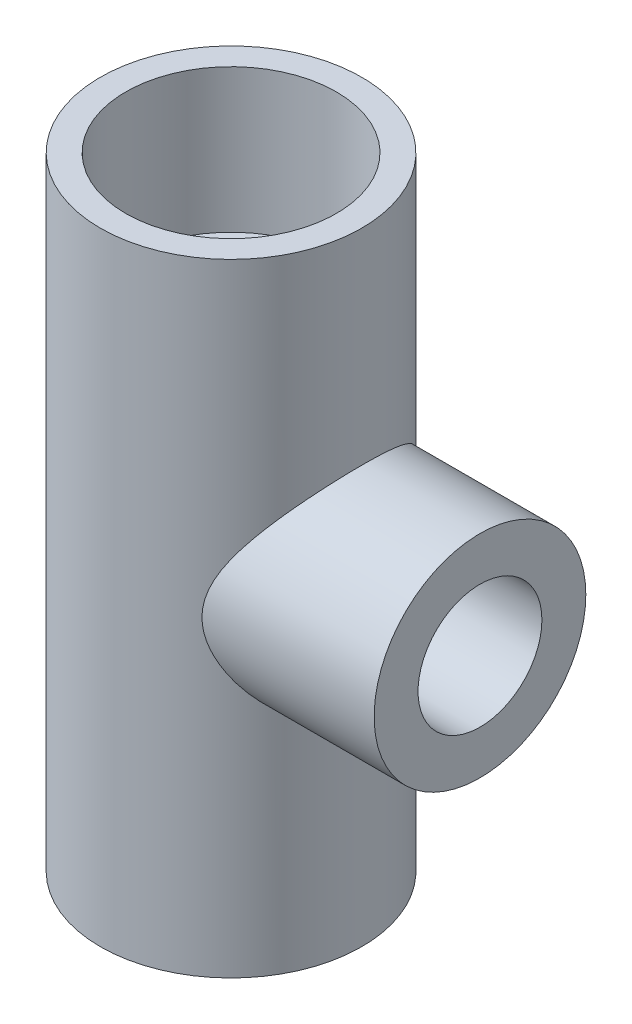
ISO-10303-21;
HEADER;
FILE_DESCRIPTION(('STEP AP214'),'2;1');
FILE_NAME('part.step','',(''),(''),'','','');
FILE_SCHEMA(('AUTOMOTIVE_DESIGN { 1 0 10303 214 1 1 1 1 }'));
ENDSEC;
DATA;
#1=APPLICATION_CONTEXT('core data for automotive mechanical design processes');
#2=APPLICATION_PROTOCOL_DEFINITION('international standard','automotive_design',2000,#1);
#3=PRODUCT_CONTEXT('',#1,'mechanical');
#4=PRODUCT('Part','Part','',(#3));
#5=PRODUCT_RELATED_PRODUCT_CATEGORY('part','',(#4));
#6=PRODUCT_DEFINITION_FORMATION('','',#4);
#7=PRODUCT_DEFINITION_CONTEXT('part definition',#1,'design');
#8=PRODUCT_DEFINITION('design','',#6,#7);
#9=PRODUCT_DEFINITION_SHAPE('','',#8);
#10=(LENGTH_UNIT() NAMED_UNIT(*) SI_UNIT(.MILLI.,.METRE.));
#11=(NAMED_UNIT(*) PLANE_ANGLE_UNIT() SI_UNIT($,.RADIAN.));
#12=(NAMED_UNIT(*) SI_UNIT($,.STERADIAN.) SOLID_ANGLE_UNIT());
#13=UNCERTAINTY_MEASURE_WITH_UNIT(LENGTH_MEASURE(1.E-05),#10,'distance_accuracy_value','');
#14=(GEOMETRIC_REPRESENTATION_CONTEXT(3) GLOBAL_UNCERTAINTY_ASSIGNED_CONTEXT((#13)) GLOBAL_UNIT_ASSIGNED_CONTEXT((#10,
#11,#12)) REPRESENTATION_CONTEXT('',''));
#15=CARTESIAN_POINT('',(0.,0.,0.));
#16=DIRECTION('',(0.,0.,1.));
#17=DIRECTION('',(1.,0.,0.));
#18=AXIS2_PLACEMENT_3D('',#15,#16,#17);
#19=CARTESIAN_POINT('',(0.,1.5625,0.));
#20=DIRECTION('',(0.,-1.,0.));
#21=DIRECTION('',(0.,0.,-1.));
#22=AXIS2_PLACEMENT_3D('',#19,#20,#21);
#23=CYLINDRICAL_SURFACE('',#22,0.6565);
#24=CARTESIAN_POINT('',(0.385356977359954,1.5625,-0.5315));
#25=CARTESIAN_POINT('',(0.385362899993711,1.58213513367773,-0.531497430191734));
#26=CARTESIAN_POINT('',(0.386888948532785,1.6017918050859,-0.530399459094584));
#27=CARTESIAN_POINT('',(0.392696221250747,1.64048165828912,-0.5261117591063));
#28=CARTESIAN_POINT('',(0.396986230809023,1.65951264787804,-0.52291535964586));
#29=CARTESIAN_POINT('',(0.409532093866903,1.70321297510211,-0.513184210097379));
#30=CARTESIAN_POINT('',(0.418659308393106,1.72744897964789,-0.50586232958749));
#31=CARTESIAN_POINT('',(0.43903034264276,1.77389069564429,-0.488289301812725));
#32=CARTESIAN_POINT('',(0.450280516063938,1.79609000725459,-0.478029312248996));
#33=CARTESIAN_POINT('',(0.478175112106839,1.84667171850496,-0.450398560466356));
#34=CARTESIAN_POINT('',(0.495234145981072,1.87416212304453,-0.431809658428912));
#35=CARTESIAN_POINT('',(0.528964559209183,1.92536215163137,-0.389765662457167));
#36=CARTESIAN_POINT('',(0.545636267578079,1.94907509284939,-0.366314880094287));
#37=CARTESIAN_POINT('',(0.573836506775219,1.98785416381428,-0.319823954647446));
#38=CARTESIAN_POINT('',(0.585724246750713,2.00369969292491,-0.297654553351851));
#39=CARTESIAN_POINT('',(0.607424189833579,2.03212586186046,-0.250401845332573));
#40=CARTESIAN_POINT('',(0.617239645119204,2.04471162460767,-0.225323201593273));
#41=CARTESIAN_POINT('',(0.632609828748361,2.06422180919848,-0.177002431531964));
#42=CARTESIAN_POINT('',(0.638600215328378,2.07173750427258,-0.154139190608849));
#43=CARTESIAN_POINT('',(0.64814440674109,2.08365646032015,-0.107121749960251));
#44=CARTESIAN_POINT('',(0.651699564924988,2.08806145007582,-0.0829682753268615));
#45=CARTESIAN_POINT('',(0.656085100100358,2.09348988817584,-0.0339431248964311));
#46=CARTESIAN_POINT('',(0.656905498072183,2.09450095232871,-0.00906915216803884));
#47=CARTESIAN_POINT('',(0.65571808258976,2.09303406568529,0.0405069558218943));
#48=CARTESIAN_POINT('',(0.653710208688219,2.09055604031836,0.0652090873994177));
#49=CARTESIAN_POINT('',(0.64724170368252,2.08252597694795,0.112259248601056));
#50=CARTESIAN_POINT('',(0.642930104768883,2.0771605900149,0.13466071478056));
#51=CARTESIAN_POINT('',(0.632266642519748,2.06377579789379,0.178136753210921));
#52=CARTESIAN_POINT('',(0.625914253544392,2.05575570892633,0.199210981935007));
#53=CARTESIAN_POINT('',(0.610878353926264,2.03653755936405,0.241603174084));
#54=CARTESIAN_POINT('',(0.60203232077856,2.02511232993413,0.262759377176164));
#55=CARTESIAN_POINT('',(0.582881847221894,1.99989966192457,0.302879567124723));
#56=CARTESIAN_POINT('',(0.572576666872963,1.98611102409865,0.321842432810783));
#57=CARTESIAN_POINT('',(0.548790520093432,1.95342514506003,0.361182484622029));
#58=CARTESIAN_POINT('',(0.535093641364971,1.93406120214982,0.38104043409325));
#59=CARTESIAN_POINT('',(0.507226713264289,1.8926735937361,0.417418882186736));
#60=CARTESIAN_POINT('',(0.493056047175519,1.8706463555671,0.433934816517956));
#61=CARTESIAN_POINT('',(0.46628822486023,1.82561792261431,0.46251905679509));
#62=CARTESIAN_POINT('',(0.453649627148158,1.80278516913905,0.474813630265242));
#63=CARTESIAN_POINT('',(0.430165975487419,1.75480010875807,0.49618533297912));
#64=CARTESIAN_POINT('',(0.419317035434605,1.72965301743948,0.505269483785877));
#65=CARTESIAN_POINT('',(0.404216657657605,1.68564848388973,0.517361579544761));
#66=CARTESIAN_POINT('',(0.398967792078354,1.66742100668977,0.52138505392601));
#67=CARTESIAN_POINT('',(0.390829997924842,1.63014943858797,0.527513629581313));
#68=CARTESIAN_POINT('',(0.387935462827879,1.61110740206065,0.529623289738708));
#69=CARTESIAN_POINT('',(0.385006683671858,1.57254033746483,0.531757626255514));
#70=CARTESIAN_POINT('',(0.384992411481192,1.55301287592314,0.531767744312222));
#71=CARTESIAN_POINT('',(0.387878699073417,1.51428306645624,0.52966489357522));
#72=CARTESIAN_POINT('',(0.390783037446115,1.49508117279855,0.527549172556664));
#73=CARTESIAN_POINT('',(0.399909237638449,1.45324802441871,0.520675827819669));
#74=CARTESIAN_POINT('',(0.406737546243582,1.43083582803116,0.515424966668835));
#75=CARTESIAN_POINT('',(0.422705265008836,1.38761010823908,0.502412752131809));
#76=CARTESIAN_POINT('',(0.431851744257976,1.36680173335534,0.494643699124589));
#77=CARTESIAN_POINT('',(0.456244252687083,1.3168449635476,0.472463242962639));
#78=CARTESIAN_POINT('',(0.472262701479041,1.2886905846602,0.456669543460802));
#79=CARTESIAN_POINT('',(0.504769406227408,1.23581651280728,0.4204719915092));
#80=CARTESIAN_POINT('',(0.521258258054518,1.21110143253699,0.400062042313242));
#81=CARTESIAN_POINT('',(0.553446897545456,1.16490510147261,0.354244373558064));
#82=CARTESIAN_POINT('',(0.569124601482922,1.14349755801896,0.328745711381395));
#83=CARTESIAN_POINT('',(0.597772941497417,1.10534612988848,0.273183821046588));
#84=CARTESIAN_POINT('',(0.610752090959783,1.08858752108032,0.24313548111569));
#85=CARTESIAN_POINT('',(0.629035500084897,1.06528864912526,0.189311412743972));
#86=CARTESIAN_POINT('',(0.635467492150333,1.05719394019285,0.166587887522797));
#87=CARTESIAN_POINT('',(0.645933329362957,1.04409317770236,0.119735247170894));
#88=CARTESIAN_POINT('',(0.649969022548455,1.03908474387972,0.0956072310014179));
#89=CARTESIAN_POINT('',(0.655320411112203,1.03245405330767,0.0464790215527377));
#90=CARTESIAN_POINT('',(0.656624352693139,1.03084642879535,0.0214755280967386));
#91=CARTESIAN_POINT('',(0.656356893592324,1.03117673557011,-0.0284931427560429));
#92=CARTESIAN_POINT('',(0.654785564542554,1.03311457852851,-0.0534583210918668));
#93=CARTESIAN_POINT('',(0.649105688369689,1.04015711070907,-0.100940642007812));
#94=CARTESIAN_POINT('',(0.645168975754438,1.04504742276963,-0.123511348366152));
#95=CARTESIAN_POINT('',(0.635198421568689,1.05753354762249,-0.167398136077195));
#96=CARTESIAN_POINT('',(0.629164031956621,1.06513006745473,-0.18871388785549));
#97=CARTESIAN_POINT('',(0.61481444874946,1.08340555961623,-0.231392797792297));
#98=CARTESIAN_POINT('',(0.606354467800784,1.09428384964671,-0.252620897133062));
#99=CARTESIAN_POINT('',(0.587927819624376,1.11840579633384,-0.292960277939736));
#100=CARTESIAN_POINT('',(0.577960535350468,1.13165042210432,-0.312070686907412));
#101=CARTESIAN_POINT('',(0.554911007304346,1.16304718816793,-0.351697663048058));
#102=CARTESIAN_POINT('',(0.541605237272403,1.18165069294043,-0.371725546684399));
#103=CARTESIAN_POINT('',(0.514385482632324,1.2214653804788,-0.408564527799153));
#104=CARTESIAN_POINT('',(0.50047060027989,1.2426805019079,-0.425370666394824));
#105=CARTESIAN_POINT('',(0.473104975290278,1.28746708994185,-0.455605847811552));
#106=CARTESIAN_POINT('',(0.459652223460136,1.31102595536969,-0.46905171657329));
#107=CARTESIAN_POINT('',(0.434478769994014,1.3606857971166,-0.492456875877506));
#108=CARTESIAN_POINT('',(0.422754782625702,1.38678179039924,-0.50242283109215));
#109=CARTESIAN_POINT('',(0.406411411867449,1.43228895225004,-0.515648568998799));
#110=CARTESIAN_POINT('',(0.400729748855495,1.45098255462144,-0.520036497927372));
#111=CARTESIAN_POINT('',(0.391818342987139,1.48926757766459,-0.526785603574873));
#112=CARTESIAN_POINT('',(0.38857904568345,1.50885517851872,-0.529154682751772));
#113=CARTESIAN_POINT('',(0.385854971396772,1.53987674268884,-0.531139188902402));
#114=CARTESIAN_POINT('',(0.385353564303765,1.55118479510108,-0.531501480912102));
#115=CARTESIAN_POINT('',(0.385356977359954,1.5625,-0.5315));
#116=B_SPLINE_CURVE_WITH_KNOTS('',3,(#24,#25,#26,#27,#28,#29,#30,#31,#32,#33,#34,#35,#36,#37,
#38,#39,#40,#41,#42,#43,#44,#45,#46,#47,#48,#49,#50,#51,#52,#53,#54,#55,#56,#57,#58,#59,#60,#61,
#62,#63,#64,#65,#66,#67,#68,#69,#70,#71,#72,#73,#74,#75,#76,#77,#78,#79,#80,#81,#82,#83,#84,#85,
#86,#87,#88,#89,#90,#91,#92,#93,#94,#95,#96,#97,#98,#99,#100,#101,#102,#103,#104,#105,#106,#107,
#108,#109,#110,#111,#112,#113,#114,#115),.UNSPECIFIED.,.T.,.F.,(4,2,2,2,2,2,2,2,2,2,2,2,2,2,2,2,
2,2,2,2,2,2,2,2,2,2,2,2,2,2,2,2,2,2,2,2,2,2,2,2,2,2,2,2,2,4),(0.,0.0588624420724026,
0.11791291043659,0.198197521328035,0.278726336418468,0.390125372829019,0.50142603865101,
0.590283238390672,0.678999934466122,0.753090165380764,0.827139187991633,0.90145811816682,
0.975778636748807,1.04578807309244,1.11581555602215,1.19239654091272,1.26901650037368,
1.36149037524443,1.45408970451969,1.54038392538853,1.62648822554958,1.6844557004685,
1.74228472609195,1.8005147270149,1.85882021286919,1.9304495193864,2.0022999389229,
2.10985506934929,2.21755308753156,2.32738322521758,2.43686143001273,2.51145501813201,
2.58599100431381,2.66084704030492,2.73570121142353,2.80568231312682,2.87568171193371,
2.9513314214701,3.02701218405472,3.11789563276467,3.20891786467854,3.29947475078172,
3.38985724015043,3.44972573703347,3.50935879767836,3.5432796562695),.UNSPECIFIED.);
#117=CARTESIAN_POINT('',(0.385356977359954,1.5625,-0.5315));
#118=VERTEX_POINT('',#117);
#119=EDGE_CURVE('E78',#118,#118,#116,.T.);
#120=ORIENTED_EDGE('',*,*,#119,.F.);
#121=EDGE_LOOP('',(#120));
#122=FACE_BOUND('',#121,.T.);
#123=CARTESIAN_POINT('',(0.,0.,0.));
#124=DIRECTION('',(0.,1.,0.));
#125=DIRECTION('',(0.,0.,1.));
#126=AXIS2_PLACEMENT_3D('',#123,#124,#125);
#127=CIRCLE('',#126,0.6565);
#128=CARTESIAN_POINT('',(0.,0.,0.6565));
#129=VERTEX_POINT('',#128);
#130=EDGE_CURVE('E10',#129,#129,#127,.T.);
#131=ORIENTED_EDGE('',*,*,#130,.T.);
#132=EDGE_LOOP('',(#131));
#133=FACE_BOUND('',#132,.T.);
#134=CARTESIAN_POINT('',(0.,3.125,0.));
#135=DIRECTION('',(0.,1.,0.));
#136=DIRECTION('',(0.,0.,1.));
#137=AXIS2_PLACEMENT_3D('',#134,#135,#136);
#138=CIRCLE('',#137,0.6565);
#139=CARTESIAN_POINT('',(0.,3.125,0.6565));
#140=VERTEX_POINT('',#139);
#141=EDGE_CURVE('E62',#140,#140,#138,.T.);
#142=ORIENTED_EDGE('',*,*,#141,.F.);
#143=EDGE_LOOP('',(#142));
#144=FACE_BOUND('',#143,.T.);
#145=ADVANCED_FACE('F39',(#122,#133,#144),#23,.T.);
#146=CARTESIAN_POINT('',(0.,1.5625,0.));
#147=DIRECTION('',(0.,-1.,0.));
#148=DIRECTION('',(0.,0.,-1.));
#149=AXIS2_PLACEMENT_3D('',#146,#147,#148);
#150=CYLINDRICAL_SURFACE('',#149,0.412);
#151=CARTESIAN_POINT('',(0.270227681779643,1.5625,-0.311));
#152=CARTESIAN_POINT('',(0.270231800428581,1.57696396762475,-0.310998018006498));
#153=CARTESIAN_POINT('',(0.271417774020262,1.59144443226721,-0.309977879363687));
#154=CARTESIAN_POINT('',(0.275879131492204,1.61982214914717,-0.306010829978069));
#155=CARTESIAN_POINT('',(0.279162005321197,1.63371711962267,-0.303057011350126));
#156=CARTESIAN_POINT('',(0.288001602319195,1.66329925749066,-0.29469085785466));
#157=CARTESIAN_POINT('',(0.293884701128306,1.67877736401987,-0.288901076866234));
#158=CARTESIAN_POINT('',(0.306744988887916,1.70826085120579,-0.275208820012607));
#159=CARTESIAN_POINT('',(0.313723609749958,1.72226426375346,-0.267303569438976));
#160=CARTESIAN_POINT('',(0.328186162092399,1.74908267068238,-0.249347107876256));
#161=CARTESIAN_POINT('',(0.335677993966191,1.76186322036197,-0.239251010825021));
#162=CARTESIAN_POINT('',(0.35040339153096,1.78576624854039,-0.217113243334809));
#163=CARTESIAN_POINT('',(0.357637171295524,1.7968901269004,-0.205073233609329));
#164=CARTESIAN_POINT('',(0.371037830246287,1.81685866012218,-0.179646292158284));
#165=CARTESIAN_POINT('',(0.377236522533365,1.82577873043,-0.166335968983784));
#166=CARTESIAN_POINT('',(0.388458638728737,1.84162064260692,-0.138109297520263));
#167=CARTESIAN_POINT('',(0.393482312218347,1.84854290889524,-0.123193291273008));
#168=CARTESIAN_POINT('',(0.401950582298115,1.86008496170245,-0.0918939555819829));
#169=CARTESIAN_POINT('',(0.405380599452794,1.86468352215044,-0.0754986565662972));
#170=CARTESIAN_POINT('',(0.410214484710458,1.87113833471078,-0.0418924071960167));
#171=CARTESIAN_POINT('',(0.411620919270967,1.87299806048709,-0.0246825186443899));
#172=CARTESIAN_POINT('',(0.412197817878378,1.87376183805048,0.00720992446208224));
#173=CARTESIAN_POINT('',(0.41167558734751,1.87307209552126,0.0218791179341206));
#174=CARTESIAN_POINT('',(0.409109230845092,1.86966224687085,0.0508414584643905));
#175=CARTESIAN_POINT('',(0.407065070899946,1.86694209542542,0.0651345971206833));
#176=CARTESIAN_POINT('',(0.401709048065682,1.85974186141316,0.0925377891610302));
#177=CARTESIAN_POINT('',(0.398436953051969,1.8553168825054,0.105670447094097));
#178=CARTESIAN_POINT('',(0.390850987443084,1.84490781533978,0.130973900097532));
#179=CARTESIAN_POINT('',(0.386536936657974,1.83892345739757,0.143144528316213));
#180=CARTESIAN_POINT('',(0.376497691282953,1.8247139563779,0.167913166815278));
#181=CARTESIAN_POINT('',(0.370661399860191,1.8162973159915,0.180355593183685));
#182=CARTESIAN_POINT('',(0.3583496417848,1.79795221020125,0.20372630165174));
#183=CARTESIAN_POINT('',(0.351873414810359,1.78802193863348,0.214652744623392));
#184=CARTESIAN_POINT('',(0.337334331543305,1.76466765653734,0.236982670072574));
#185=CARTESIAN_POINT('',(0.329215393721002,1.750943187021,0.248036054320871));
#186=CARTESIAN_POINT('',(0.313374923424585,1.72166336554909,0.267767866387255));
#187=CARTESIAN_POINT('',(0.305653284838088,1.7061085061485,0.276446931050284));
#188=CARTESIAN_POINT('',(0.293612030679355,1.6778216995218,0.289119090334268));
#189=CARTESIAN_POINT('',(0.288945719680043,1.6655219860807,0.293743722352639));
#190=CARTESIAN_POINT('',(0.280881639322993,1.64006379238828,0.301464459954555));
#191=CARTESIAN_POINT('',(0.277480854566521,1.62690744238622,0.304564204676213));
#192=CARTESIAN_POINT('',(0.272869256103213,1.60200304643884,0.308698331828988));
#193=CARTESIAN_POINT('',(0.271404661299305,1.59034373514283,0.309974525059859));
#194=CARTESIAN_POINT('',(0.270009684451288,1.56686642467,0.31119091665821));
#195=CARTESIAN_POINT('',(0.270078199651425,1.55504854566459,0.311132075306695));
#196=CARTESIAN_POINT('',(0.271733813968862,1.53163361099592,0.309686531624986));
#197=CARTESIAN_POINT('',(0.273317707584935,1.52003614189904,0.308302632203947));
#198=CARTESIAN_POINT('',(0.277757041375019,1.49730059014472,0.304308681867854));
#199=CARTESIAN_POINT('',(0.280614533666111,1.48616328070473,0.30169665172254));
#200=CARTESIAN_POINT('',(0.288846778226851,1.4593408516847,0.293865496725938));
#201=CARTESIAN_POINT('',(0.294772227931217,1.44401677010071,0.287997171845058));
#202=CARTESIAN_POINT('',(0.307670101094281,1.41481643394301,0.274176503376951));
#203=CARTESIAN_POINT('',(0.314644837424924,1.40094349550181,0.266219526311427));
#204=CARTESIAN_POINT('',(0.329169134457223,1.37419287491217,0.248056428818811));
#205=CARTESIAN_POINT('',(0.336730397104507,1.36137040699689,0.237778479518087));
#206=CARTESIAN_POINT('',(0.35156071900152,1.33742229553647,0.215246177846788));
#207=CARTESIAN_POINT('',(0.358830055276664,1.32629501390402,0.202993757311382));
#208=CARTESIAN_POINT('',(0.372158586571142,1.30651335720167,0.177311768968786));
#209=CARTESIAN_POINT('',(0.378262635037398,1.29775575851889,0.163985791577648));
#210=CARTESIAN_POINT('',(0.389284856027398,1.28223309388001,0.135758848410265));
#211=CARTESIAN_POINT('',(0.394203336189957,1.27546751092185,0.120858292662279));
#212=CARTESIAN_POINT('',(0.402459322181857,1.26422966761955,0.0896283376746975));
#213=CARTESIAN_POINT('',(0.405782501809908,1.25977815980543,0.073287495613873));
#214=CARTESIAN_POINT('',(0.410416707407641,1.25359356362919,0.0398268434840364));
#215=CARTESIAN_POINT('',(0.411730147944887,1.25185721313136,0.0227079936542613));
#216=CARTESIAN_POINT('',(0.412160308501303,1.25128786772846,-0.0090411406279077));
#217=CARTESIAN_POINT('',(0.411575154576484,1.25206085540103,-0.0236622027950966));
#218=CARTESIAN_POINT('',(0.408896219714951,1.2556213366374,-0.0525134099271459));
#219=CARTESIAN_POINT('',(0.406802384275697,1.25840890297976,-0.0667435407499629));
#220=CARTESIAN_POINT('',(0.40135307386021,1.26573899280182,-0.0940696147730142));
#221=CARTESIAN_POINT('',(0.398031813008929,1.27023400845715,-0.10718542615078));
#222=CARTESIAN_POINT('',(0.390354651865791,1.28077886799265,-0.132445085404893));
#223=CARTESIAN_POINT('',(0.385998580181287,1.2868289694507,-0.144588771825134));
#224=CARTESIAN_POINT('',(0.37586784787918,1.30118974660626,-0.169319443955819));
#225=CARTESIAN_POINT('',(0.369981240651725,1.30969489063531,-0.181746953882424));
#226=CARTESIAN_POINT('',(0.357579117176789,1.32821982491861,-0.205075908116648));
#227=CARTESIAN_POINT('',(0.351062811537317,1.338241525474,-0.215975393840116));
#228=CARTESIAN_POINT('',(0.336451720454894,1.36180272677544,-0.238233397308171));
#229=CARTESIAN_POINT('',(0.328304255425852,1.37564375516352,-0.24923884265715));
#230=CARTESIAN_POINT('',(0.312443703925714,1.40516742014959,-0.268851934186774));
#231=CARTESIAN_POINT('',(0.304730449697799,1.42084933819637,-0.277460511537721));
#232=CARTESIAN_POINT('',(0.292868687840478,1.44909553517562,-0.289866445125011));
#233=CARTESIAN_POINT('',(0.288341332235457,1.4612055010325,-0.294333526148818));
#234=CARTESIAN_POINT('',(0.280531709709312,1.48624297798497,-0.301786816697079));
#235=CARTESIAN_POINT('',(0.277245781414361,1.49916795167081,-0.304777389060259));
#236=CARTESIAN_POINT('',(0.273340792454843,1.520580768786,-0.308273950467403));
#237=CARTESIAN_POINT('',(0.272182817892329,1.52888860161752,-0.309292232840336));
#238=CARTESIAN_POINT('',(0.270625125075153,1.54562909888496,-0.310655779011472));
#239=CARTESIAN_POINT('',(0.270225278965759,1.55406174203044,-0.311001156292167));
#240=CARTESIAN_POINT('',(0.270227681779643,1.5625,-0.311));
#241=B_SPLINE_CURVE_WITH_KNOTS('',3,(#151,#152,#153,#154,#155,#156,#157,#158,#159,#160,#161,
#162,#163,#164,#165,#166,#167,#168,#169,#170,#171,#172,#173,#174,#175,#176,#177,#178,#179,#180,
#181,#182,#183,#184,#185,#186,#187,#188,#189,#190,#191,#192,#193,#194,#195,#196,#197,#198,#199,
#200,#201,#202,#203,#204,#205,#206,#207,#208,#209,#210,#211,#212,#213,#214,#215,#216,#217,#218,
#219,#220,#221,#222,#223,#224,#225,#226,#227,#228,#229,#230,#231,#232,#233,#234,#235,#236,#237,
#238,#239,#240),.UNSPECIFIED.,.T.,.F.,(4,2,2,2,2,2,2,2,2,2,2,2,2,2,2,2,2,2,2,2,2,2,2,2,2,2,2,2,
2,2,2,2,2,2,2,2,2,2,2,2,2,2,2,2,4),(0.,0.0433471319846624,0.0868499687205027,0.139187033709352,
0.191593084792587,0.245195979200589,0.298753319841556,0.350088592843357,0.401412951991044,
0.453198025982103,0.504917364232135,0.548777302950409,0.592638220770965,0.635186559351342,
0.677742261275871,0.72591435818788,0.774144393829549,0.832124459164776,0.890088957684489,
0.931792446607527,0.973395921560189,1.00869445531757,1.04396759989286,1.07916629527851,
1.11442191161517,1.16647286665687,1.21864028231235,1.27272231998086,1.32675176116782,
1.37777154354976,1.42877807270722,1.4802344607127,1.53162897862163,1.57536644236929,
1.61910548625321,1.66170744060359,1.70431645591483,1.75264758078357,1.80104009972434,
1.85922083230243,1.91737893034056,1.95829258433065,1.99908461071823,2.02437753126353,
2.04966618589944),.UNSPECIFIED.);
#242=CARTESIAN_POINT('',(0.270227681779643,1.5625,-0.311));
#243=VERTEX_POINT('',#242);
#244=EDGE_CURVE('E131',#243,#243,#241,.T.);
#245=ORIENTED_EDGE('',*,*,#244,.T.);
#246=EDGE_LOOP('',(#245));
#247=FACE_BOUND('',#246,.T.);
#248=CARTESIAN_POINT('',(0.,2.405,0.));
#249=DIRECTION('',(0.,1.,0.));
#250=DIRECTION('',(0.,0.,1.));
#251=AXIS2_PLACEMENT_3D('',#248,#249,#250);
#252=CIRCLE('',#251,0.412);
#253=CARTESIAN_POINT('',(0.,2.405,0.412));
#254=VERTEX_POINT('',#253);
#255=EDGE_CURVE('E72',#254,#254,#252,.T.);
#256=ORIENTED_EDGE('',*,*,#255,.T.);
#257=EDGE_LOOP('',(#256));
#258=FACE_BOUND('',#257,.T.);
#259=CARTESIAN_POINT('',(0.,0.72,0.));
#260=DIRECTION('',(0.,1.,0.));
#261=DIRECTION('',(0.,0.,1.));
#262=AXIS2_PLACEMENT_3D('',#259,#260,#261);
#263=CIRCLE('',#262,0.412);
#264=CARTESIAN_POINT('',(0.,0.72,0.412));
#265=VERTEX_POINT('',#264);
#266=EDGE_CURVE('E51',#265,#265,#263,.T.);
#267=ORIENTED_EDGE('',*,*,#266,.F.);
#268=EDGE_LOOP('',(#267));
#269=FACE_BOUND('',#268,.T.);
#270=ADVANCED_FACE('F121',(#247,#258,#269),#150,.F.);
#271=CARTESIAN_POINT('',(0.,0.,0.));
#272=DIRECTION('',(0.,1.,0.));
#273=DIRECTION('',(0.,0.,1.));
#274=AXIS2_PLACEMENT_3D('',#271,#272,#273);
#275=PLANE('',#274);
#276=CARTESIAN_POINT('',(0.,0.,0.));
#277=DIRECTION('',(0.,1.,0.));
#278=DIRECTION('',(0.,0.,1.));
#279=AXIS2_PLACEMENT_3D('',#276,#277,#278);
#280=CIRCLE('',#279,0.529);
#281=CARTESIAN_POINT('',(0.,0.,0.529));
#282=VERTEX_POINT('',#281);
#283=EDGE_CURVE('E57',#282,#282,#280,.T.);
#284=ORIENTED_EDGE('',*,*,#283,.T.);
#285=EDGE_LOOP('',(#284));
#286=FACE_BOUND('',#285,.T.);
#287=ORIENTED_EDGE('',*,*,#130,.F.);
#288=EDGE_LOOP('',(#287));
#289=FACE_BOUND('',#288,.T.);
#290=ADVANCED_FACE('F119',(#286,#289),#275,.F.);
#291=CARTESIAN_POINT('',(0.,0.72,0.));
#292=DIRECTION('',(0.,-1.,0.));
#293=DIRECTION('',(0.,0.,-1.));
#294=AXIS2_PLACEMENT_3D('',#291,#292,#293);
#295=CYLINDRICAL_SURFACE('',#294,0.529);
#296=CARTESIAN_POINT('',(0.,0.72,0.));
#297=DIRECTION('',(0.,1.,0.));
#298=DIRECTION('',(0.,0.,1.));
#299=AXIS2_PLACEMENT_3D('',#296,#297,#298);
#300=CIRCLE('',#299,0.529);
#301=CARTESIAN_POINT('',(0.,0.72,0.529));
#302=VERTEX_POINT('',#301);
#303=EDGE_CURVE('E46',#302,#302,#300,.T.);
#304=ORIENTED_EDGE('',*,*,#303,.T.);
#305=EDGE_LOOP('',(#304));
#306=FACE_BOUND('',#305,.T.);
#307=ORIENTED_EDGE('',*,*,#283,.F.);
#308=EDGE_LOOP('',(#307));
#309=FACE_BOUND('',#308,.T.);
#310=ADVANCED_FACE('F115',(#306,#309),#295,.F.);
#311=CARTESIAN_POINT('',(0.,0.72,0.));
#312=DIRECTION('',(0.,1.,0.));
#313=DIRECTION('',(0.,0.,1.));
#314=AXIS2_PLACEMENT_3D('',#311,#312,#313);
#315=PLANE('',#314);
#316=ORIENTED_EDGE('',*,*,#266,.T.);
#317=EDGE_LOOP('',(#316));
#318=FACE_BOUND('',#317,.T.);
#319=ORIENTED_EDGE('',*,*,#303,.F.);
#320=EDGE_LOOP('',(#319));
#321=FACE_BOUND('',#320,.T.);
#322=ADVANCED_FACE('F111',(#318,#321),#315,.F.);
#323=CARTESIAN_POINT('',(0.,3.125,0.));
#324=DIRECTION('',(0.,-1.,0.));
#325=DIRECTION('',(0.,0.,1.));
#326=AXIS2_PLACEMENT_3D('',#323,#324,#325);
#327=PLANE('',#326);
#328=CARTESIAN_POINT('',(0.,3.125,0.));
#329=DIRECTION('',(0.,1.,0.));
#330=DIRECTION('',(0.,0.,1.));
#331=AXIS2_PLACEMENT_3D('',#328,#329,#330);
#332=CIRCLE('',#331,0.529);
#333=CARTESIAN_POINT('',(0.,3.125,0.529));
#334=VERTEX_POINT('',#333);
#335=EDGE_CURVE('E75',#334,#334,#332,.T.);
#336=ORIENTED_EDGE('',*,*,#335,.F.);
#337=EDGE_LOOP('',(#336));
#338=FACE_BOUND('',#337,.T.);
#339=ORIENTED_EDGE('',*,*,#141,.T.);
#340=EDGE_LOOP('',(#339));
#341=FACE_BOUND('',#340,.T.);
#342=ADVANCED_FACE('F107',(#338,#341),#327,.F.);
#343=CARTESIAN_POINT('',(0.,2.405,0.));
#344=DIRECTION('',(0.,1.,0.));
#345=DIRECTION('',(0.,0.,1.));
#346=AXIS2_PLACEMENT_3D('',#343,#344,#345);
#347=CYLINDRICAL_SURFACE('',#346,0.529);
#348=CARTESIAN_POINT('',(0.,2.405,0.));
#349=DIRECTION('',(0.,1.,0.));
#350=DIRECTION('',(0.,0.,1.));
#351=AXIS2_PLACEMENT_3D('',#348,#349,#350);
#352=CIRCLE('',#351,0.529);
#353=CARTESIAN_POINT('',(0.,2.405,0.529));
#354=VERTEX_POINT('',#353);
#355=EDGE_CURVE('E67',#354,#354,#352,.T.);
#356=ORIENTED_EDGE('',*,*,#355,.F.);
#357=EDGE_LOOP('',(#356));
#358=FACE_BOUND('',#357,.T.);
#359=ORIENTED_EDGE('',*,*,#335,.T.);
#360=EDGE_LOOP('',(#359));
#361=FACE_BOUND('',#360,.T.);
#362=ADVANCED_FACE('F103',(#358,#361),#347,.F.);
#363=CARTESIAN_POINT('',(0.,2.405,0.));
#364=DIRECTION('',(0.,-1.,0.));
#365=DIRECTION('',(0.,0.,1.));
#366=AXIS2_PLACEMENT_3D('',#363,#364,#365);
#367=PLANE('',#366);
#368=ORIENTED_EDGE('',*,*,#255,.F.);
#369=EDGE_LOOP('',(#368));
#370=FACE_BOUND('',#369,.T.);
#371=ORIENTED_EDGE('',*,*,#355,.T.);
#372=EDGE_LOOP('',(#371));
#373=FACE_BOUND('',#372,.T.);
#374=ADVANCED_FACE('F99',(#370,#373),#367,.F.);
#375=CARTESIAN_POINT('',(-0.6575,1.5625,0.));
#376=DIRECTION('',(1.,0.,0.));
#377=DIRECTION('',(0.,0.,-1.));
#378=AXIS2_PLACEMENT_3D('',#375,#376,#377);
#379=CYLINDRICAL_SURFACE('',#378,0.311);
#380=CARTESIAN_POINT('',(1.25,1.5625,0.));
#381=DIRECTION('',(1.,0.,0.));
#382=DIRECTION('',(0.,0.,-1.));
#383=AXIS2_PLACEMENT_3D('',#380,#381,#382);
#384=CIRCLE('',#383,0.311);
#385=CARTESIAN_POINT('',(1.25,1.5625,-0.311));
#386=VERTEX_POINT('',#385);
#387=EDGE_CURVE('E92',#386,#386,#384,.T.);
#388=ORIENTED_EDGE('',*,*,#387,.T.);
#389=EDGE_LOOP('',(#388));
#390=FACE_BOUND('',#389,.T.);
#391=ORIENTED_EDGE('',*,*,#244,.F.);
#392=EDGE_LOOP('',(#391));
#393=FACE_BOUND('',#392,.T.);
#394=ADVANCED_FACE('F102',(#390,#393),#379,.F.);
#395=CARTESIAN_POINT('',(1.25,0.,0.));
#396=DIRECTION('',(1.,0.,0.));
#397=DIRECTION('',(0.,0.,-1.));
#398=AXIS2_PLACEMENT_3D('',#395,#396,#397);
#399=PLANE('',#398);
#400=ORIENTED_EDGE('',*,*,#387,.F.);
#401=EDGE_LOOP('',(#400));
#402=FACE_BOUND('',#401,.T.);
#403=CARTESIAN_POINT('',(1.25,1.5625,0.));
#404=DIRECTION('',(1.,0.,0.));
#405=DIRECTION('',(0.,0.,-1.));
#406=AXIS2_PLACEMENT_3D('',#403,#404,#405);
#407=CIRCLE('',#406,0.5315);
#408=CARTESIAN_POINT('',(1.25,1.5625,-0.5315));
#409=VERTEX_POINT('',#408);
#410=EDGE_CURVE('E91',#409,#409,#407,.T.);
#411=ORIENTED_EDGE('',*,*,#410,.T.);
#412=EDGE_LOOP('',(#411));
#413=FACE_BOUND('',#412,.T.);
#414=ADVANCED_FACE('F152',(#402,#413),#399,.T.);
#415=CARTESIAN_POINT('',(-0.6575,1.5625,0.));
#416=DIRECTION('',(1.,0.,0.));
#417=DIRECTION('',(0.,0.,-1.));
#418=AXIS2_PLACEMENT_3D('',#415,#416,#417);
#419=CYLINDRICAL_SURFACE('',#418,0.5315);
#420=ORIENTED_EDGE('',*,*,#410,.F.);
#421=EDGE_LOOP('',(#420));
#422=FACE_BOUND('',#421,.T.);
#423=ORIENTED_EDGE('',*,*,#119,.T.);
#424=EDGE_LOOP('',(#423));
#425=FACE_BOUND('',#424,.T.);
#426=ADVANCED_FACE('F94',(#422,#425),#419,.T.);
#427=CLOSED_SHELL('',(#145,#270,#290,#310,#322,#342,#362,#374,#394,#414,#426));
#428=MANIFOLD_SOLID_BREP('B2',#427);
#429=ADVANCED_BREP_SHAPE_REPRESENTATION('',(#18,#428),#14);
#430=SHAPE_DEFINITION_REPRESENTATION(#9,#429);
ENDSEC;
END-ISO-10303-21;
